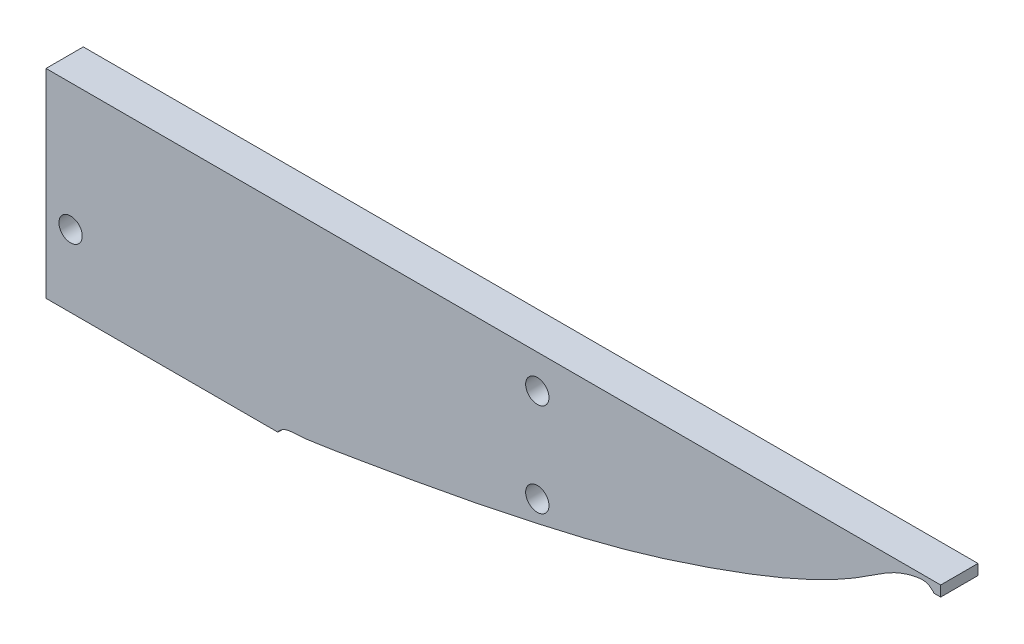
ISO-10303-21;
HEADER;
FILE_DESCRIPTION(('STEP AP214'),'2;1');
FILE_NAME('part.step','',(''),(''),'','','');
FILE_SCHEMA(('AUTOMOTIVE_DESIGN { 1 0 10303 214 1 1 1 1 }'));
ENDSEC;
DATA;
#1=APPLICATION_CONTEXT('core data for automotive mechanical design processes');
#2=APPLICATION_PROTOCOL_DEFINITION('international standard','automotive_design',2000,#1);
#3=PRODUCT_CONTEXT('',#1,'mechanical');
#4=PRODUCT('Part','Part','',(#3));
#5=PRODUCT_RELATED_PRODUCT_CATEGORY('part','',(#4));
#6=PRODUCT_DEFINITION_FORMATION('','',#4);
#7=PRODUCT_DEFINITION_CONTEXT('part definition',#1,'design');
#8=PRODUCT_DEFINITION('design','',#6,#7);
#9=PRODUCT_DEFINITION_SHAPE('','',#8);
#10=(LENGTH_UNIT() NAMED_UNIT(*) SI_UNIT(.MILLI.,.METRE.));
#11=(NAMED_UNIT(*) PLANE_ANGLE_UNIT() SI_UNIT($,.RADIAN.));
#12=(NAMED_UNIT(*) SI_UNIT($,.STERADIAN.) SOLID_ANGLE_UNIT());
#13=UNCERTAINTY_MEASURE_WITH_UNIT(LENGTH_MEASURE(1.E-05),#10,'distance_accuracy_value','');
#14=(GEOMETRIC_REPRESENTATION_CONTEXT(3) GLOBAL_UNCERTAINTY_ASSIGNED_CONTEXT((#13)) GLOBAL_UNIT_ASSIGNED_CONTEXT((#10,
#11,#12)) REPRESENTATION_CONTEXT('',''));
#15=CARTESIAN_POINT('',(0.,0.,0.));
#16=DIRECTION('',(0.,0.,1.));
#17=DIRECTION('',(1.,0.,0.));
#18=AXIS2_PLACEMENT_3D('',#15,#16,#17);
#19=CARTESIAN_POINT('',(16.8607684429994,-25.5370188551769,300.));
#20=DIRECTION('',(0.,0.,-1.));
#21=DIRECTION('',(-1.,0.,0.));
#22=AXIS2_PLACEMENT_3D('',#19,#20,#21);
#23=PLANE('',#22);
#24=CARTESIAN_POINT('',(0.0705666698621599,-25.,300.));
#25=DIRECTION('',(0.,0.,-1.));
#26=DIRECTION('',(-1.,0.,0.));
#27=AXIS2_PLACEMENT_3D('',#24,#25,#26);
#28=CIRCLE('',#27,2.5);
#29=CARTESIAN_POINT('',(-2.42943333013784,-25.,300.));
#30=VERTEX_POINT('',#29);
#31=EDGE_CURVE('E248',#30,#30,#28,.F.);
#32=ORIENTED_EDGE('',*,*,#31,.F.);
#33=EDGE_LOOP('',(#32));
#34=FACE_BOUND('',#33,.T.);
#35=DIRECTION('',(0.,1.,0.));
#36=VECTOR('',#35,1.);
#37=CARTESIAN_POINT('',(86.5572460776108,2.25600000000005,300.));
#38=LINE('',#37,#36);
#39=CARTESIAN_POINT('',(86.5572460776108,0.,300.));
#40=VERTEX_POINT('',#39);
#41=CARTESIAN_POINT('',(86.5572460776108,2.25600000000005,300.));
#42=VERTEX_POINT('',#41);
#43=EDGE_CURVE('E211',#40,#42,#38,.T.);
#44=ORIENTED_EDGE('',*,*,#43,.T.);
#45=DIRECTION('',(-1.,0.,0.));
#46=VECTOR('',#45,1.);
#47=CARTESIAN_POINT('',(86.5572460776108,2.25600000000005,300.));
#48=LINE('',#47,#46);
#49=CARTESIAN_POINT('',(-105.272870472238,2.25600000000002,300.));
#50=VERTEX_POINT('',#49);
#51=EDGE_CURVE('E87',#42,#50,#48,.T.);
#52=ORIENTED_EDGE('',*,*,#51,.T.);
#53=DIRECTION('',(0.,-1.,0.));
#54=VECTOR('',#53,1.);
#55=CARTESIAN_POINT('',(-105.272870472238,-40.4404892803156,300.));
#56=LINE('',#55,#54);
#57=CARTESIAN_POINT('',(-105.272870472238,-40.4404892803156,300.));
#58=VERTEX_POINT('',#57);
#59=EDGE_CURVE('E102',#50,#58,#56,.T.);
#60=ORIENTED_EDGE('',*,*,#59,.T.);
#61=CARTESIAN_POINT('',(-55.5544529766166,-40.4343597966195,300.));
#62=CARTESIAN_POINT('',(-72.1272586525758,-40.4374163293631,300.));
#63=CARTESIAN_POINT('',(-88.7000645474232,-40.4394433718746,300.));
#64=CARTESIAN_POINT('',(-105.272870472238,-40.4404892803156,300.));
#65=B_SPLINE_CURVE_WITH_KNOTS('',3,(#61,#62,#63,#64),.UNSPECIFIED.,.F.,.F.,(4,4),(0.,1.),.UNSPECIFIED.);
#66=CARTESIAN_POINT('',(-55.5544529766166,-40.4343597966195,300.));
#67=VERTEX_POINT('',#66);
#68=EDGE_CURVE('E94',#58,#67,#65,.F.);
#69=ORIENTED_EDGE('',*,*,#68,.T.);
#70=CARTESIAN_POINT('',(85.0855136596268,0.,300.));
#71=CARTESIAN_POINT('',(85.0538768980386,0.0945870382661421,300.));
#72=CARTESIAN_POINT('',(84.9940057916154,0.175170360392239,300.));
#73=CARTESIAN_POINT('',(84.8551231635307,0.316544136888718,300.));
#74=CARTESIAN_POINT('',(84.7793247980283,0.379760409469801,300.));
#75=CARTESIAN_POINT('',(84.5525862568294,0.570180791263056,300.));
#76=CARTESIAN_POINT('',(84.405222577994,0.701617381551992,300.));
#77=CARTESIAN_POINT('',(84.0848097071874,0.934187553258435,300.));
#78=CARTESIAN_POINT('',(83.9160075103376,1.03349903509502,300.));
#79=CARTESIAN_POINT('',(83.5465298464179,1.16918350625682,300.));
#80=CARTESIAN_POINT('',(83.3506732412956,1.20858440015079,300.));
#81=CARTESIAN_POINT('',(82.961346871966,1.25138523801547,300.));
#82=CARTESIAN_POINT('',(82.7644981120879,1.25622940329705,300.));
#83=CARTESIAN_POINT('',(82.3703808367188,1.24743167438723,300.));
#84=CARTESIAN_POINT('',(82.1749209929949,1.2346145937227,300.));
#85=CARTESIAN_POINT('',(81.5924868656568,1.17538940379028,300.));
#86=CARTESIAN_POINT('',(81.2096242391095,1.10733196445242,300.));
#87=CARTESIAN_POINT('',(80.4489700725841,0.944516019718897,300.));
#88=CARTESIAN_POINT('',(80.0712669950249,0.849291728369638,300.));
#89=CARTESIAN_POINT('',(79.3205798728308,0.633995766689287,300.));
#90=CARTESIAN_POINT('',(78.9474677845956,0.51417481814822,300.));
#91=CARTESIAN_POINT('',(77.8472998592125,0.12570686193773,300.));
#92=CARTESIAN_POINT('',(77.13529823392,-0.174320452621728,300.));
#93=CARTESIAN_POINT('',(75.061427007407,-1.19334218137166,300.));
#94=CARTESIAN_POINT('',(73.7585073185454,-2.02518188917851,300.));
#95=CARTESIAN_POINT('',(71.8186279668747,-3.30069852782262,300.));
#96=CARTESIAN_POINT('',(71.1740638976271,-3.72977921013421,300.));
#97=CARTESIAN_POINT('',(69.8768807370644,-4.57296975641563,300.));
#98=CARTESIAN_POINT('',(69.2251976026404,-4.98884915007147,300.));
#99=CARTESIAN_POINT('',(67.2522120040772,-6.20332565054704,300.));
#100=CARTESIAN_POINT('',(65.912124144367,-6.96719101656376,300.));
#101=CARTESIAN_POINT('',(63.1992020882162,-8.4343780525515,300.));
#102=CARTESIAN_POINT('',(61.8267267536495,-9.13836321121711,300.));
#103=CARTESIAN_POINT('',(59.0574663506205,-10.5013880083191,300.));
#104=CARTESIAN_POINT('',(57.6604157082591,-11.1599366353319,300.));
#105=CARTESIAN_POINT('',(54.8413786383798,-12.4309308821837,300.));
#106=CARTESIAN_POINT('',(53.4204225565922,-13.0436783231168,300.));
#107=CARTESIAN_POINT('',(49.1373489506121,-14.8266121714697,300.));
#108=CARTESIAN_POINT('',(46.2527424363193,-15.945808570071,300.));
#109=CARTESIAN_POINT('',(40.452485738412,-18.0973151114968,300.));
#110=CARTESIAN_POINT('',(37.5350399113119,-19.1275791270873,300.));
#111=CARTESIAN_POINT('',(31.6762755320208,-21.1117804821059,300.));
#112=CARTESIAN_POINT('',(28.7352339502558,-22.067135514992,300.));
#113=CARTESIAN_POINT('',(22.8224743156311,-23.8811658659394,300.));
#114=CARTESIAN_POINT('',(19.8484016738164,-24.7362767291014,300.));
#115=CARTESIAN_POINT('',(13.8731352121823,-26.3377609812524,300.));
#116=CARTESIAN_POINT('',(10.8723378157311,-27.0854001818172,300.));
#117=CARTESIAN_POINT('',(4.8540477611221,-28.5133315695908,300.));
#118=CARTESIAN_POINT('',(1.83697253694916,-29.1964317584696,300.));
#119=CARTESIAN_POINT('',(-7.22619368373048,-31.187926758128,300.));
#120=CARTESIAN_POINT('',(-13.2866225794314,-32.4303348523372,300.));
#121=CARTESIAN_POINT('',(-25.4482941594834,-34.7079919903853,300.));
#122=CARTESIAN_POINT('',(-31.5462677008067,-35.7534995973373,300.));
#123=CARTESIAN_POINT('',(-39.1698861301945,-37.051378227144,300.));
#124=CARTESIAN_POINT('',(-40.6946422293636,-37.3107607091218,300.));
#125=CARTESIAN_POINT('',(-42.9830356338027,-37.6922998476091,300.));
#126=CARTESIAN_POINT('',(-43.7460475394953,-37.8181985835498,300.));
#127=CARTESIAN_POINT('',(-45.2723846400749,-38.0681216587906,300.));
#128=CARTESIAN_POINT('',(-46.0354079524113,-38.1943908626862,300.));
#129=CARTESIAN_POINT('',(-47.5635039316977,-38.4316573159028,300.));
#130=CARTESIAN_POINT('',(-48.3289272614756,-38.5401270603643,300.));
#131=CARTESIAN_POINT('',(-49.4819168639404,-38.666957118875,300.));
#132=CARTESIAN_POINT('',(-49.8671018988199,-38.7035108534049,300.));
#133=CARTESIAN_POINT('',(-50.6387344649093,-38.7642424574335,300.));
#134=CARTESIAN_POINT('',(-51.0253481919217,-38.7859734607566,300.));
#135=CARTESIAN_POINT('',(-51.798802859869,-38.8269751735629,300.));
#136=CARTESIAN_POINT('',(-52.1853782029714,-38.8491218014922,300.));
#137=CARTESIAN_POINT('',(-52.7627334428368,-38.9094961659391,300.));
#138=CARTESIAN_POINT('',(-52.9547798483967,-38.9340100254362,300.));
#139=CARTESIAN_POINT('',(-53.3375359795179,-38.9975114418581,300.));
#140=CARTESIAN_POINT('',(-53.5294755561898,-39.0372465660703,300.));
#141=CARTESIAN_POINT('',(-53.9029571346969,-39.1417734272569,300.));
#142=CARTESIAN_POINT('',(-54.0844472127084,-39.2064702497463,300.));
#143=CARTESIAN_POINT('',(-54.4321272484171,-39.3720937278193,300.));
#144=CARTESIAN_POINT('',(-54.5982371116286,-39.4764740956718,300.));
#145=CARTESIAN_POINT('',(-54.9128357941062,-39.7106519637802,300.));
#146=CARTESIAN_POINT('',(-55.0594097987295,-39.8407932328166,300.));
#147=CARTESIAN_POINT('',(-55.2770630945049,-40.0386918385824,300.));
#148=CARTESIAN_POINT('',(-55.3484065225031,-40.1058868275927,300.));
#149=CARTESIAN_POINT('',(-55.4758054777564,-40.2553141542091,300.));
#150=CARTESIAN_POINT('',(-55.5295474718406,-40.3404475219741,300.));
#151=CARTESIAN_POINT('',(-55.5544529766166,-40.4343597966195,300.));
#152=B_SPLINE_CURVE_WITH_KNOTS('',3,(#70,#71,#72,#73,#74,#75,#76,#77,#78,#79,#80,#81,#82,#83,
#84,#85,#86,#87,#88,#89,#90,#91,#92,#93,#94,#95,#96,#97,#98,#99,#100,#101,#102,#103,#104,#105,
#106,#107,#108,#109,#110,#111,#112,#113,#114,#115,#116,#117,#118,#119,#120,#121,#122,#123,#124,
#125,#126,#127,#128,#129,#130,#131,#132,#133,#134,#135,#136,#137,#138,#139,#140,#141,#142,#143,
#144,#145,#146,#147,#148,#149,#150,#151),.UNSPECIFIED.,.F.,.F.,(4,2,2,2,2,2,2,2,2,2,2,2,2,2,2,2,
2,2,2,2,2,2,2,2,2,2,2,2,2,2,2,2,2,2,2,2,2,2,2,2,4),(0.,0.001953125,0.00390624999999989,
0.00781249999999989,0.0117187499999998,0.0156249999999997,0.0195312499999996,0.0234374999999996,
0.0312499999999997,0.0390624999999998,0.0468749999999999,0.0625000000000001,0.0937500000000002,
0.109375,0.125,0.15625,0.1875,0.21875,0.25,0.3125,0.375,0.4375,0.5,0.5625,0.625,0.75,0.875,
0.90625,0.921875,0.9375,0.953125,0.9609375,0.96875,0.9765625,0.98046875,0.984375,0.98828125,
0.9921875,0.99609375,0.998046875,1.),.UNSPECIFIED.);
#153=CARTESIAN_POINT('',(85.0855136596268,0.,300.));
#154=VERTEX_POINT('',#153);
#155=EDGE_CURVE('E99',#67,#154,#152,.F.);
#156=ORIENTED_EDGE('',*,*,#155,.T.);
#157=DIRECTION('',(1.,0.,0.));
#158=VECTOR('',#157,1.);
#159=CARTESIAN_POINT('',(85.0855136596268,0.,300.));
#160=LINE('',#159,#158);
#161=EDGE_CURVE('E49',#154,#40,#160,.T.);
#162=ORIENTED_EDGE('',*,*,#161,.T.);
#163=EDGE_LOOP('',(#44,#52,#60,#69,#156,#162));
#164=FACE_BOUND('',#163,.T.);
#165=CARTESIAN_POINT('',(0.0705666698621599,-4.96037406111782,300.));
#166=DIRECTION('',(0.,0.,-1.));
#167=DIRECTION('',(-1.,0.,0.));
#168=AXIS2_PLACEMENT_3D('',#165,#166,#167);
#169=CIRCLE('',#168,2.5);
#170=CARTESIAN_POINT('',(-2.42943333013784,-4.96037406111782,300.));
#171=VERTEX_POINT('',#170);
#172=EDGE_CURVE('E159',#171,#171,#169,.F.);
#173=ORIENTED_EDGE('',*,*,#172,.F.);
#174=EDGE_LOOP('',(#173));
#175=FACE_BOUND('',#174,.T.);
#176=CARTESIAN_POINT('',(-100.,-25.,300.));
#177=DIRECTION('',(0.,0.,-1.));
#178=DIRECTION('',(-1.,0.,0.));
#179=AXIS2_PLACEMENT_3D('',#176,#177,#178);
#180=CIRCLE('',#179,2.5);
#181=CARTESIAN_POINT('',(-102.5,-25.,300.));
#182=VERTEX_POINT('',#181);
#183=EDGE_CURVE('E256',#182,#182,#180,.F.);
#184=ORIENTED_EDGE('',*,*,#183,.F.);
#185=EDGE_LOOP('',(#184));
#186=FACE_BOUND('',#185,.T.);
#187=ADVANCED_FACE('F30',(#34,#164,#175,#186),#23,.F.);
#188=CARTESIAN_POINT('',(16.8607684429994,-25.5370188551769,292.));
#189=DIRECTION('',(0.,0.,-1.));
#190=DIRECTION('',(-1.,0.,0.));
#191=AXIS2_PLACEMENT_3D('',#188,#189,#190);
#192=PLANE('',#191);
#193=CARTESIAN_POINT('',(0.0705666698621599,-25.,292.));
#194=DIRECTION('',(0.,0.,-1.));
#195=DIRECTION('',(-1.,0.,0.));
#196=AXIS2_PLACEMENT_3D('',#193,#194,#195);
#197=CIRCLE('',#196,2.5);
#198=CARTESIAN_POINT('',(-2.42943333013784,-25.,292.));
#199=VERTEX_POINT('',#198);
#200=EDGE_CURVE('E251',#199,#199,#197,.F.);
#201=ORIENTED_EDGE('',*,*,#200,.T.);
#202=EDGE_LOOP('',(#201));
#203=FACE_BOUND('',#202,.T.);
#204=DIRECTION('',(0.,1.,0.));
#205=VECTOR('',#204,1.);
#206=CARTESIAN_POINT('',(86.5572460776108,2.25600000000005,292.));
#207=LINE('',#206,#205);
#208=CARTESIAN_POINT('',(86.5572460776108,0.,292.));
#209=VERTEX_POINT('',#208);
#210=CARTESIAN_POINT('',(86.5572460776108,2.25600000000005,292.));
#211=VERTEX_POINT('',#210);
#212=EDGE_CURVE('E152',#209,#211,#207,.T.);
#213=ORIENTED_EDGE('',*,*,#212,.F.);
#214=DIRECTION('',(1.,0.,0.));
#215=VECTOR('',#214,1.);
#216=CARTESIAN_POINT('',(85.0855136596268,0.,292.));
#217=LINE('',#216,#215);
#218=CARTESIAN_POINT('',(85.0855136596268,0.,292.));
#219=VERTEX_POINT('',#218);
#220=EDGE_CURVE('E79',#219,#209,#217,.T.);
#221=ORIENTED_EDGE('',*,*,#220,.F.);
#222=CARTESIAN_POINT('',(-55.5544529766166,-40.4343597966195,292.));
#223=CARTESIAN_POINT('',(-55.5295474718406,-40.3404475219741,292.));
#224=CARTESIAN_POINT('',(-55.4758054777564,-40.2553141542091,292.));
#225=CARTESIAN_POINT('',(-55.3484065225031,-40.1058868275927,292.));
#226=CARTESIAN_POINT('',(-55.2770630945049,-40.0386918385824,292.));
#227=CARTESIAN_POINT('',(-55.0594097987295,-39.8407932328166,292.));
#228=CARTESIAN_POINT('',(-54.9128357941062,-39.7106519637802,292.));
#229=CARTESIAN_POINT('',(-54.5982371116286,-39.4764740956718,292.));
#230=CARTESIAN_POINT('',(-54.4321272484171,-39.3720937278193,292.));
#231=CARTESIAN_POINT('',(-54.0844472127084,-39.2064702497463,292.));
#232=CARTESIAN_POINT('',(-53.9029571346969,-39.1417734272569,292.));
#233=CARTESIAN_POINT('',(-53.5294755561898,-39.0372465660703,292.));
#234=CARTESIAN_POINT('',(-53.3375359795179,-38.9975114418581,292.));
#235=CARTESIAN_POINT('',(-52.9547798483967,-38.9340100254362,292.));
#236=CARTESIAN_POINT('',(-52.7627334428368,-38.9094961659391,292.));
#237=CARTESIAN_POINT('',(-52.1853782029714,-38.8491218014922,292.));
#238=CARTESIAN_POINT('',(-51.798802859869,-38.8269751735629,292.));
#239=CARTESIAN_POINT('',(-51.0253481919217,-38.7859734607566,292.));
#240=CARTESIAN_POINT('',(-50.6387344649093,-38.7642424574335,292.));
#241=CARTESIAN_POINT('',(-49.8671018988199,-38.7035108534049,292.));
#242=CARTESIAN_POINT('',(-49.4819168639404,-38.666957118875,292.));
#243=CARTESIAN_POINT('',(-48.3289272614756,-38.5401270603643,292.));
#244=CARTESIAN_POINT('',(-47.5635039316977,-38.4316573159028,292.));
#245=CARTESIAN_POINT('',(-46.0354079524113,-38.1943908626862,292.));
#246=CARTESIAN_POINT('',(-45.2723846400749,-38.0681216587906,292.));
#247=CARTESIAN_POINT('',(-43.7460475394953,-37.8181985835498,292.));
#248=CARTESIAN_POINT('',(-42.9830356338027,-37.6922998476091,292.));
#249=CARTESIAN_POINT('',(-40.6946422293636,-37.3107607091218,292.));
#250=CARTESIAN_POINT('',(-39.1698861301945,-37.051378227144,292.));
#251=CARTESIAN_POINT('',(-31.5462677008067,-35.7534995973373,292.));
#252=CARTESIAN_POINT('',(-25.4482941594834,-34.7079919903853,292.));
#253=CARTESIAN_POINT('',(-13.2866225794314,-32.4303348523372,292.));
#254=CARTESIAN_POINT('',(-7.22619368373048,-31.187926758128,292.));
#255=CARTESIAN_POINT('',(1.83697253694916,-29.1964317584696,292.));
#256=CARTESIAN_POINT('',(4.8540477611221,-28.5133315695908,292.));
#257=CARTESIAN_POINT('',(10.8723378157311,-27.0854001818172,292.));
#258=CARTESIAN_POINT('',(13.8731352121823,-26.3377609812524,292.));
#259=CARTESIAN_POINT('',(19.8484016738164,-24.7362767291014,292.));
#260=CARTESIAN_POINT('',(22.8224743156311,-23.8811658659394,292.));
#261=CARTESIAN_POINT('',(28.7352339502558,-22.067135514992,292.));
#262=CARTESIAN_POINT('',(31.6762755320208,-21.1117804821059,292.));
#263=CARTESIAN_POINT('',(37.5350399113119,-19.1275791270873,292.));
#264=CARTESIAN_POINT('',(40.452485738412,-18.0973151114968,292.));
#265=CARTESIAN_POINT('',(46.2527424363193,-15.945808570071,292.));
#266=CARTESIAN_POINT('',(49.1373489506121,-14.8266121714697,292.));
#267=CARTESIAN_POINT('',(53.4204225565922,-13.0436783231168,292.));
#268=CARTESIAN_POINT('',(54.8413786383798,-12.4309308821837,292.));
#269=CARTESIAN_POINT('',(57.6604157082591,-11.1599366353319,292.));
#270=CARTESIAN_POINT('',(59.0574663506205,-10.5013880083191,292.));
#271=CARTESIAN_POINT('',(61.8267267536495,-9.13836321121711,292.));
#272=CARTESIAN_POINT('',(63.1992020882162,-8.4343780525515,292.));
#273=CARTESIAN_POINT('',(65.912124144367,-6.96719101656376,292.));
#274=CARTESIAN_POINT('',(67.2522120040772,-6.20332565054704,292.));
#275=CARTESIAN_POINT('',(69.2251976026404,-4.98884915007147,292.));
#276=CARTESIAN_POINT('',(69.8768807370644,-4.57296975641563,292.));
#277=CARTESIAN_POINT('',(71.1740638976271,-3.72977921013421,292.));
#278=CARTESIAN_POINT('',(71.8186279668747,-3.30069852782262,292.));
#279=CARTESIAN_POINT('',(73.7585073185454,-2.02518188917851,292.));
#280=CARTESIAN_POINT('',(75.061427007407,-1.19334218137166,292.));
#281=CARTESIAN_POINT('',(77.13529823392,-0.174320452621728,292.));
#282=CARTESIAN_POINT('',(77.8472998592125,0.12570686193773,292.));
#283=CARTESIAN_POINT('',(78.9474677845956,0.51417481814822,292.));
#284=CARTESIAN_POINT('',(79.3205798728308,0.633995766689287,292.));
#285=CARTESIAN_POINT('',(80.0712669950249,0.849291728369638,292.));
#286=CARTESIAN_POINT('',(80.4489700725841,0.944516019718897,292.));
#287=CARTESIAN_POINT('',(81.2096242391095,1.10733196445242,292.));
#288=CARTESIAN_POINT('',(81.5924868656568,1.17538940379028,292.));
#289=CARTESIAN_POINT('',(82.1749209929949,1.2346145937227,292.));
#290=CARTESIAN_POINT('',(82.3703808367188,1.24743167438723,292.));
#291=CARTESIAN_POINT('',(82.7644981120879,1.25622940329705,292.));
#292=CARTESIAN_POINT('',(82.961346871966,1.25138523801547,292.));
#293=CARTESIAN_POINT('',(83.3506732412956,1.20858440015079,292.));
#294=CARTESIAN_POINT('',(83.5465298464179,1.16918350625682,292.));
#295=CARTESIAN_POINT('',(83.9160075103376,1.03349903509502,292.));
#296=CARTESIAN_POINT('',(84.0848097071874,0.934187553258435,292.));
#297=CARTESIAN_POINT('',(84.405222577994,0.701617381551992,292.));
#298=CARTESIAN_POINT('',(84.5525862568294,0.570180791263056,292.));
#299=CARTESIAN_POINT('',(84.7793247980283,0.379760409469801,292.));
#300=CARTESIAN_POINT('',(84.8551231635307,0.316544136888718,292.));
#301=CARTESIAN_POINT('',(84.9940057916154,0.175170360392239,292.));
#302=CARTESIAN_POINT('',(85.0538768980386,0.0945870382661421,292.));
#303=CARTESIAN_POINT('',(85.0855136596268,0.,292.));
#304=B_SPLINE_CURVE_WITH_KNOTS('',3,(#222,#223,#224,#225,#226,#227,#228,#229,#230,#231,#232,
#233,#234,#235,#236,#237,#238,#239,#240,#241,#242,#243,#244,#245,#246,#247,#248,#249,#250,#251,
#252,#253,#254,#255,#256,#257,#258,#259,#260,#261,#262,#263,#264,#265,#266,#267,#268,#269,#270,
#271,#272,#273,#274,#275,#276,#277,#278,#279,#280,#281,#282,#283,#284,#285,#286,#287,#288,#289,
#290,#291,#292,#293,#294,#295,#296,#297,#298,#299,#300,#301,#302,#303),.UNSPECIFIED.,.F.,.F.,(4,
2,2,2,2,2,2,2,2,2,2,2,2,2,2,2,2,2,2,2,2,2,2,2,2,2,2,2,2,2,2,2,2,2,2,2,2,2,2,2,4),(0.,
0.00195312500000011,0.00390625000000011,0.00781250000000022,0.0117187500000002,
0.0156250000000002,0.0195312500000002,0.0234375000000003,0.0312500000000002,0.0390625000000002,
0.0468750000000001,0.0625000000000001,0.0781250000000001,0.0937500000000001,0.125,0.25,0.375,
0.4375,0.5,0.5625,0.625,0.6875,0.75,0.78125,0.8125,0.84375,0.875,0.890625,0.90625,0.9375,
0.953125,0.9609375,0.96875,0.9765625,0.98046875,0.984375,0.98828125,0.9921875,0.99609375,
0.998046875,1.),.UNSPECIFIED.);
#305=CARTESIAN_POINT('',(-55.5544529766166,-40.4343597966195,292.));
#306=VERTEX_POINT('',#305);
#307=EDGE_CURVE('E72',#306,#219,#304,.T.);
#308=ORIENTED_EDGE('',*,*,#307,.F.);
#309=CARTESIAN_POINT('',(-105.272870472238,-40.4404892803156,292.));
#310=CARTESIAN_POINT('',(-88.7000645474232,-40.4394433718746,292.));
#311=CARTESIAN_POINT('',(-72.1272586525758,-40.4374163293631,292.));
#312=CARTESIAN_POINT('',(-55.5544529766166,-40.4343597966195,292.));
#313=B_SPLINE_CURVE_WITH_KNOTS('',3,(#309,#310,#311,#312),.UNSPECIFIED.,.F.,.F.,(4,4),(0.,1.),.UNSPECIFIED.);
#314=CARTESIAN_POINT('',(-105.272870472238,-40.4404892803156,292.));
#315=VERTEX_POINT('',#314);
#316=EDGE_CURVE('E112',#315,#306,#313,.T.);
#317=ORIENTED_EDGE('',*,*,#316,.F.);
#318=DIRECTION('',(0.,-1.,0.));
#319=VECTOR('',#318,1.);
#320=CARTESIAN_POINT('',(-105.272870472238,-40.4404892803156,292.));
#321=LINE('',#320,#319);
#322=CARTESIAN_POINT('',(-105.272870472238,2.25600000000002,292.));
#323=VERTEX_POINT('',#322);
#324=EDGE_CURVE('E161',#323,#315,#321,.T.);
#325=ORIENTED_EDGE('',*,*,#324,.F.);
#326=DIRECTION('',(-1.,0.,0.));
#327=VECTOR('',#326,1.);
#328=CARTESIAN_POINT('',(86.5572460776108,2.25600000000005,292.));
#329=LINE('',#328,#327);
#330=EDGE_CURVE('E158',#211,#323,#329,.T.);
#331=ORIENTED_EDGE('',*,*,#330,.F.);
#332=EDGE_LOOP('',(#213,#221,#308,#317,#325,#331));
#333=FACE_BOUND('',#332,.T.);
#334=CARTESIAN_POINT('',(0.0705666698621599,-4.96037406111782,292.));
#335=DIRECTION('',(0.,0.,-1.));
#336=DIRECTION('',(-1.,0.,0.));
#337=AXIS2_PLACEMENT_3D('',#334,#335,#336);
#338=CIRCLE('',#337,2.5);
#339=CARTESIAN_POINT('',(-2.42943333013784,-4.96037406111782,292.));
#340=VERTEX_POINT('',#339);
#341=EDGE_CURVE('E250',#340,#340,#338,.F.);
#342=ORIENTED_EDGE('',*,*,#341,.T.);
#343=EDGE_LOOP('',(#342));
#344=FACE_BOUND('',#343,.T.);
#345=CARTESIAN_POINT('',(-100.,-25.,292.));
#346=DIRECTION('',(0.,0.,-1.));
#347=DIRECTION('',(-1.,0.,0.));
#348=AXIS2_PLACEMENT_3D('',#345,#346,#347);
#349=CIRCLE('',#348,2.5);
#350=CARTESIAN_POINT('',(-102.5,-25.,292.));
#351=VERTEX_POINT('',#350);
#352=EDGE_CURVE('E34',#351,#351,#349,.F.);
#353=ORIENTED_EDGE('',*,*,#352,.T.);
#354=EDGE_LOOP('',(#353));
#355=FACE_BOUND('',#354,.T.);
#356=ADVANCED_FACE('F188',(#203,#333,#344,#355),#192,.T.);
#357=CARTESIAN_POINT('',(86.5572460776108,2.25600000000005,300.));
#358=DIRECTION('',(-1.,0.,0.));
#359=DIRECTION('',(0.,0.,1.));
#360=AXIS2_PLACEMENT_3D('',#357,#358,#359);
#361=PLANE('',#360);
#362=ORIENTED_EDGE('',*,*,#212,.T.);
#363=DIRECTION('',(0.,0.,-1.));
#364=VECTOR('',#363,1.);
#365=CARTESIAN_POINT('',(86.5572460776108,2.25600000000005,300.));
#366=LINE('',#365,#364);
#367=EDGE_CURVE('E11',#42,#211,#366,.T.);
#368=ORIENTED_EDGE('',*,*,#367,.F.);
#369=ORIENTED_EDGE('',*,*,#43,.F.);
#370=DIRECTION('',(0.,0.,-1.));
#371=VECTOR('',#370,1.);
#372=CARTESIAN_POINT('',(86.5572460776108,0.,300.));
#373=LINE('',#372,#371);
#374=EDGE_CURVE('E162',#40,#209,#373,.T.);
#375=ORIENTED_EDGE('',*,*,#374,.T.);
#376=EDGE_LOOP('',(#362,#368,#369,#375));
#377=FACE_BOUND('',#376,.T.);
#378=ADVANCED_FACE('F32',(#377),#361,.F.);
#379=CARTESIAN_POINT('',(86.5572460776108,2.25600000000005,300.));
#380=DIRECTION('',(0.,-1.,0.));
#381=DIRECTION('',(1.,0.,0.));
#382=AXIS2_PLACEMENT_3D('',#379,#380,#381);
#383=PLANE('',#382);
#384=ORIENTED_EDGE('',*,*,#330,.T.);
#385=DIRECTION('',(0.,0.,-1.));
#386=VECTOR('',#385,1.);
#387=CARTESIAN_POINT('',(-105.272870472238,2.25600000000002,300.));
#388=LINE('',#387,#386);
#389=EDGE_CURVE('E40',#50,#323,#388,.T.);
#390=ORIENTED_EDGE('',*,*,#389,.F.);
#391=ORIENTED_EDGE('',*,*,#51,.F.);
#392=ORIENTED_EDGE('',*,*,#367,.T.);
#393=EDGE_LOOP('',(#384,#390,#391,#392));
#394=FACE_BOUND('',#393,.T.);
#395=ADVANCED_FACE('F218',(#394),#383,.F.);
#396=CARTESIAN_POINT('',(-105.272870472238,-40.4404892803156,300.));
#397=DIRECTION('',(1.,0.,0.));
#398=DIRECTION('',(0.,1.,0.));
#399=AXIS2_PLACEMENT_3D('',#396,#397,#398);
#400=PLANE('',#399);
#401=ORIENTED_EDGE('',*,*,#324,.T.);
#402=DIRECTION('',(0.,0.,-1.));
#403=VECTOR('',#402,1.);
#404=CARTESIAN_POINT('',(-105.272870472238,-40.4404892803156,300.));
#405=LINE('',#404,#403);
#406=EDGE_CURVE('E114',#58,#315,#405,.T.);
#407=ORIENTED_EDGE('',*,*,#406,.F.);
#408=ORIENTED_EDGE('',*,*,#59,.F.);
#409=ORIENTED_EDGE('',*,*,#389,.T.);
#410=EDGE_LOOP('',(#401,#407,#408,#409));
#411=FACE_BOUND('',#410,.T.);
#412=ADVANCED_FACE('F214',(#411),#400,.F.);
#413=CARTESIAN_POINT('',(-105.272870472238,-40.4404892803156,300.));
#414=CARTESIAN_POINT('',(-88.7000645474232,-40.4394433718746,300.));
#415=CARTESIAN_POINT('',(-72.1272586525758,-40.4374163293631,300.));
#416=CARTESIAN_POINT('',(-55.5544529766166,-40.4343597966195,300.));
#417=B_SPLINE_CURVE_WITH_KNOTS('',3,(#413,#414,#415,#416),.UNSPECIFIED.,.F.,.F.,(4,4),(0.,1.),.UNSPECIFIED.);
#418=DIRECTION('',(0.,0.,-1.));
#419=VECTOR('',#418,1.);
#420=SURFACE_OF_LINEAR_EXTRUSION('',#417,#419);
#421=ORIENTED_EDGE('',*,*,#316,.T.);
#422=DIRECTION('',(0.,0.,-1.));
#423=VECTOR('',#422,1.);
#424=CARTESIAN_POINT('',(-55.5544529766166,-40.4343597966195,300.));
#425=LINE('',#424,#423);
#426=EDGE_CURVE('E109',#67,#306,#425,.T.);
#427=ORIENTED_EDGE('',*,*,#426,.F.);
#428=ORIENTED_EDGE('',*,*,#68,.F.);
#429=ORIENTED_EDGE('',*,*,#406,.T.);
#430=EDGE_LOOP('',(#421,#427,#428,#429));
#431=FACE_BOUND('',#430,.T.);
#432=ADVANCED_FACE('F110',(#431),#420,.F.);
#433=CARTESIAN_POINT('',(-55.5544529766166,-40.4343597966195,300.));
#434=CARTESIAN_POINT('',(-55.5295474718406,-40.3404475219741,300.));
#435=CARTESIAN_POINT('',(-55.4758054777564,-40.2553141542091,300.));
#436=CARTESIAN_POINT('',(-55.3484065225031,-40.1058868275927,300.));
#437=CARTESIAN_POINT('',(-55.2770630945049,-40.0386918385824,300.));
#438=CARTESIAN_POINT('',(-55.0594097987295,-39.8407932328166,300.));
#439=CARTESIAN_POINT('',(-54.9128357941062,-39.7106519637802,300.));
#440=CARTESIAN_POINT('',(-54.5982371116286,-39.4764740956718,300.));
#441=CARTESIAN_POINT('',(-54.4321272484171,-39.3720937278193,300.));
#442=CARTESIAN_POINT('',(-54.0844472127084,-39.2064702497463,300.));
#443=CARTESIAN_POINT('',(-53.9029571346969,-39.1417734272569,300.));
#444=CARTESIAN_POINT('',(-53.5294755561898,-39.0372465660703,300.));
#445=CARTESIAN_POINT('',(-53.3375359795179,-38.9975114418581,300.));
#446=CARTESIAN_POINT('',(-52.9547798483967,-38.9340100254362,300.));
#447=CARTESIAN_POINT('',(-52.7627334428368,-38.9094961659391,300.));
#448=CARTESIAN_POINT('',(-52.1853782029714,-38.8491218014922,300.));
#449=CARTESIAN_POINT('',(-51.798802859869,-38.8269751735629,300.));
#450=CARTESIAN_POINT('',(-51.0253481919217,-38.7859734607566,300.));
#451=CARTESIAN_POINT('',(-50.6387344649093,-38.7642424574335,300.));
#452=CARTESIAN_POINT('',(-49.8671018988199,-38.7035108534049,300.));
#453=CARTESIAN_POINT('',(-49.4819168639404,-38.666957118875,300.));
#454=CARTESIAN_POINT('',(-48.3289272614756,-38.5401270603643,300.));
#455=CARTESIAN_POINT('',(-47.5635039316977,-38.4316573159028,300.));
#456=CARTESIAN_POINT('',(-46.0354079524113,-38.1943908626862,300.));
#457=CARTESIAN_POINT('',(-45.2723846400749,-38.0681216587906,300.));
#458=CARTESIAN_POINT('',(-43.7460475394953,-37.8181985835498,300.));
#459=CARTESIAN_POINT('',(-42.9830356338027,-37.6922998476091,300.));
#460=CARTESIAN_POINT('',(-40.6946422293636,-37.3107607091218,300.));
#461=CARTESIAN_POINT('',(-39.1698861301945,-37.051378227144,300.));
#462=CARTESIAN_POINT('',(-31.5462677008067,-35.7534995973373,300.));
#463=CARTESIAN_POINT('',(-25.4482941594834,-34.7079919903853,300.));
#464=CARTESIAN_POINT('',(-13.2866225794314,-32.4303348523372,300.));
#465=CARTESIAN_POINT('',(-7.22619368373048,-31.187926758128,300.));
#466=CARTESIAN_POINT('',(1.83697253694916,-29.1964317584696,300.));
#467=CARTESIAN_POINT('',(4.8540477611221,-28.5133315695908,300.));
#468=CARTESIAN_POINT('',(10.8723378157311,-27.0854001818172,300.));
#469=CARTESIAN_POINT('',(13.8731352121823,-26.3377609812524,300.));
#470=CARTESIAN_POINT('',(19.8484016738164,-24.7362767291014,300.));
#471=CARTESIAN_POINT('',(22.8224743156311,-23.8811658659394,300.));
#472=CARTESIAN_POINT('',(28.7352339502558,-22.067135514992,300.));
#473=CARTESIAN_POINT('',(31.6762755320208,-21.1117804821059,300.));
#474=CARTESIAN_POINT('',(37.5350399113119,-19.1275791270873,300.));
#475=CARTESIAN_POINT('',(40.452485738412,-18.0973151114968,300.));
#476=CARTESIAN_POINT('',(46.2527424363193,-15.945808570071,300.));
#477=CARTESIAN_POINT('',(49.1373489506121,-14.8266121714697,300.));
#478=CARTESIAN_POINT('',(53.4204225565922,-13.0436783231168,300.));
#479=CARTESIAN_POINT('',(54.8413786383798,-12.4309308821837,300.));
#480=CARTESIAN_POINT('',(57.6604157082591,-11.1599366353319,300.));
#481=CARTESIAN_POINT('',(59.0574663506205,-10.5013880083191,300.));
#482=CARTESIAN_POINT('',(61.8267267536495,-9.13836321121711,300.));
#483=CARTESIAN_POINT('',(63.1992020882162,-8.4343780525515,300.));
#484=CARTESIAN_POINT('',(65.912124144367,-6.96719101656376,300.));
#485=CARTESIAN_POINT('',(67.2522120040772,-6.20332565054704,300.));
#486=CARTESIAN_POINT('',(69.2251976026404,-4.98884915007147,300.));
#487=CARTESIAN_POINT('',(69.8768807370644,-4.57296975641563,300.));
#488=CARTESIAN_POINT('',(71.1740638976271,-3.72977921013421,300.));
#489=CARTESIAN_POINT('',(71.8186279668747,-3.30069852782262,300.));
#490=CARTESIAN_POINT('',(73.7585073185454,-2.02518188917851,300.));
#491=CARTESIAN_POINT('',(75.061427007407,-1.19334218137166,300.));
#492=CARTESIAN_POINT('',(77.13529823392,-0.174320452621728,300.));
#493=CARTESIAN_POINT('',(77.8472998592125,0.12570686193773,300.));
#494=CARTESIAN_POINT('',(78.9474677845956,0.51417481814822,300.));
#495=CARTESIAN_POINT('',(79.3205798728308,0.633995766689287,300.));
#496=CARTESIAN_POINT('',(80.0712669950249,0.849291728369638,300.));
#497=CARTESIAN_POINT('',(80.4489700725841,0.944516019718897,300.));
#498=CARTESIAN_POINT('',(81.2096242391095,1.10733196445242,300.));
#499=CARTESIAN_POINT('',(81.5924868656568,1.17538940379028,300.));
#500=CARTESIAN_POINT('',(82.1749209929949,1.2346145937227,300.));
#501=CARTESIAN_POINT('',(82.3703808367188,1.24743167438723,300.));
#502=CARTESIAN_POINT('',(82.7644981120879,1.25622940329705,300.));
#503=CARTESIAN_POINT('',(82.961346871966,1.25138523801547,300.));
#504=CARTESIAN_POINT('',(83.3506732412956,1.20858440015079,300.));
#505=CARTESIAN_POINT('',(83.5465298464179,1.16918350625682,300.));
#506=CARTESIAN_POINT('',(83.9160075103376,1.03349903509502,300.));
#507=CARTESIAN_POINT('',(84.0848097071874,0.934187553258435,300.));
#508=CARTESIAN_POINT('',(84.405222577994,0.701617381551992,300.));
#509=CARTESIAN_POINT('',(84.5525862568294,0.570180791263056,300.));
#510=CARTESIAN_POINT('',(84.7793247980283,0.379760409469801,300.));
#511=CARTESIAN_POINT('',(84.8551231635307,0.316544136888718,300.));
#512=CARTESIAN_POINT('',(84.9940057916154,0.175170360392239,300.));
#513=CARTESIAN_POINT('',(85.0538768980386,0.0945870382661421,300.));
#514=CARTESIAN_POINT('',(85.0855136596268,0.,300.));
#515=B_SPLINE_CURVE_WITH_KNOTS('',3,(#433,#434,#435,#436,#437,#438,#439,#440,#441,#442,#443,
#444,#445,#446,#447,#448,#449,#450,#451,#452,#453,#454,#455,#456,#457,#458,#459,#460,#461,#462,
#463,#464,#465,#466,#467,#468,#469,#470,#471,#472,#473,#474,#475,#476,#477,#478,#479,#480,#481,
#482,#483,#484,#485,#486,#487,#488,#489,#490,#491,#492,#493,#494,#495,#496,#497,#498,#499,#500,
#501,#502,#503,#504,#505,#506,#507,#508,#509,#510,#511,#512,#513,#514),.UNSPECIFIED.,.F.,.F.,(4,
2,2,2,2,2,2,2,2,2,2,2,2,2,2,2,2,2,2,2,2,2,2,2,2,2,2,2,2,2,2,2,2,2,2,2,2,2,2,2,4),(0.,
0.00195312500000011,0.00390625000000011,0.00781250000000022,0.0117187500000002,
0.0156250000000002,0.0195312500000002,0.0234375000000003,0.0312500000000002,0.0390625000000002,
0.0468750000000001,0.0625000000000001,0.0781250000000001,0.0937500000000001,0.125,0.25,0.375,
0.4375,0.5,0.5625,0.625,0.6875,0.75,0.78125,0.8125,0.84375,0.875,0.890625,0.90625,0.9375,
0.953125,0.9609375,0.96875,0.9765625,0.98046875,0.984375,0.98828125,0.9921875,0.99609375,
0.998046875,1.),.UNSPECIFIED.);
#516=DIRECTION('',(0.,0.,-1.));
#517=VECTOR('',#516,1.);
#518=SURFACE_OF_LINEAR_EXTRUSION('',#515,#517);
#519=ORIENTED_EDGE('',*,*,#307,.T.);
#520=DIRECTION('',(0.,0.,-1.));
#521=VECTOR('',#520,1.);
#522=CARTESIAN_POINT('',(85.0855136596268,0.,300.));
#523=LINE('',#522,#521);
#524=EDGE_CURVE('E115',#154,#219,#523,.T.);
#525=ORIENTED_EDGE('',*,*,#524,.F.);
#526=ORIENTED_EDGE('',*,*,#155,.F.);
#527=ORIENTED_EDGE('',*,*,#426,.T.);
#528=EDGE_LOOP('',(#519,#525,#526,#527));
#529=FACE_BOUND('',#528,.T.);
#530=ADVANCED_FACE('F118',(#529),#518,.F.);
#531=CARTESIAN_POINT('',(85.0855136596268,0.,300.));
#532=DIRECTION('',(0.,1.,0.));
#533=DIRECTION('',(-1.,0.,0.));
#534=AXIS2_PLACEMENT_3D('',#531,#532,#533);
#535=PLANE('',#534);
#536=ORIENTED_EDGE('',*,*,#220,.T.);
#537=ORIENTED_EDGE('',*,*,#374,.F.);
#538=ORIENTED_EDGE('',*,*,#161,.F.);
#539=ORIENTED_EDGE('',*,*,#524,.T.);
#540=EDGE_LOOP('',(#536,#537,#538,#539));
#541=FACE_BOUND('',#540,.T.);
#542=ADVANCED_FACE('F138',(#541),#535,.F.);
#543=CARTESIAN_POINT('',(0.0705666698621599,-4.96037406111782,308.));
#544=DIRECTION('',(0.,0.,-1.));
#545=DIRECTION('',(-1.,0.,0.));
#546=AXIS2_PLACEMENT_3D('',#543,#544,#545);
#547=CYLINDRICAL_SURFACE('',#546,2.5);
#548=ORIENTED_EDGE('',*,*,#341,.F.);
#549=EDGE_LOOP('',(#548));
#550=FACE_BOUND('',#549,.T.);
#551=ORIENTED_EDGE('',*,*,#172,.T.);
#552=EDGE_LOOP('',(#551));
#553=FACE_BOUND('',#552,.T.);
#554=ADVANCED_FACE('F236',(#550,#553),#547,.F.);
#555=CARTESIAN_POINT('',(0.0705666698621599,-25.,308.));
#556=DIRECTION('',(0.,0.,-1.));
#557=DIRECTION('',(-1.,0.,0.));
#558=AXIS2_PLACEMENT_3D('',#555,#556,#557);
#559=CYLINDRICAL_SURFACE('',#558,2.5);
#560=ORIENTED_EDGE('',*,*,#200,.F.);
#561=EDGE_LOOP('',(#560));
#562=FACE_BOUND('',#561,.T.);
#563=ORIENTED_EDGE('',*,*,#31,.T.);
#564=EDGE_LOOP('',(#563));
#565=FACE_BOUND('',#564,.T.);
#566=ADVANCED_FACE('F240',(#562,#565),#559,.F.);
#567=CARTESIAN_POINT('',(-100.,-25.,308.));
#568=DIRECTION('',(0.,0.,-1.));
#569=DIRECTION('',(-1.,0.,0.));
#570=AXIS2_PLACEMENT_3D('',#567,#568,#569);
#571=CYLINDRICAL_SURFACE('',#570,2.5);
#572=ORIENTED_EDGE('',*,*,#352,.F.);
#573=EDGE_LOOP('',(#572));
#574=FACE_BOUND('',#573,.T.);
#575=ORIENTED_EDGE('',*,*,#183,.T.);
#576=EDGE_LOOP('',(#575));
#577=FACE_BOUND('',#576,.T.);
#578=ADVANCED_FACE('F285',(#574,#577),#571,.F.);
#579=CLOSED_SHELL('',(#187,#356,#378,#395,#412,#432,#530,#542,#554,#566,#578));
#580=MANIFOLD_SOLID_BREP('B2',#579);
#581=ADVANCED_BREP_SHAPE_REPRESENTATION('',(#18,#580),#14);
#582=SHAPE_DEFINITION_REPRESENTATION(#9,#581);
ENDSEC;
END-ISO-10303-21;
